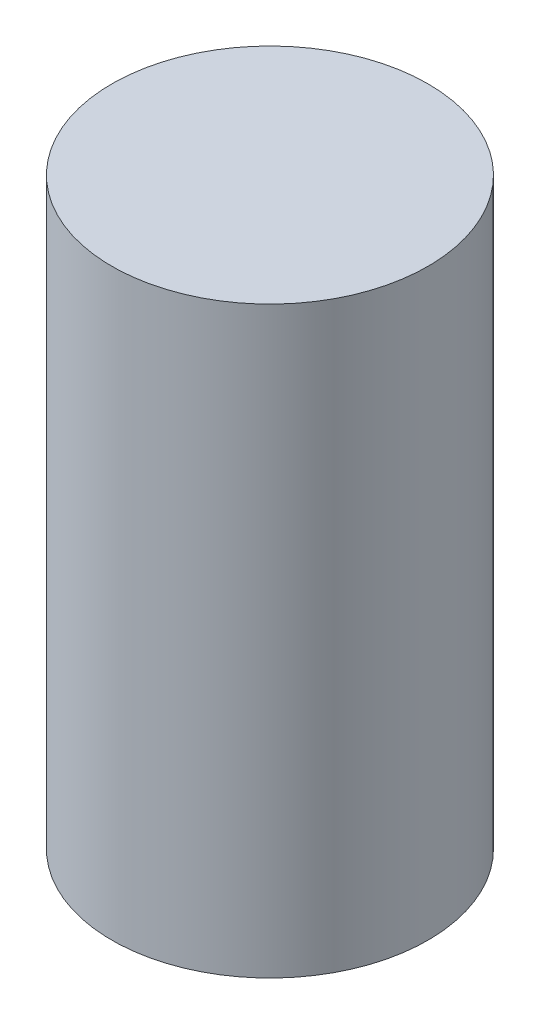
ISO-10303-21;
HEADER;
FILE_DESCRIPTION(('STEP AP214'),'2;1');
FILE_NAME('part.step','',(''),(''),'','','');
FILE_SCHEMA(('AUTOMOTIVE_DESIGN { 1 0 10303 214 1 1 1 1 }'));
ENDSEC;
DATA;
#1=APPLICATION_CONTEXT('core data for automotive mechanical design processes');
#2=APPLICATION_PROTOCOL_DEFINITION('international standard','automotive_design',2000,#1);
#3=PRODUCT_CONTEXT('',#1,'mechanical');
#4=PRODUCT('Part','Part','',(#3));
#5=PRODUCT_RELATED_PRODUCT_CATEGORY('part','',(#4));
#6=PRODUCT_DEFINITION_FORMATION('','',#4);
#7=PRODUCT_DEFINITION_CONTEXT('part definition',#1,'design');
#8=PRODUCT_DEFINITION('design','',#6,#7);
#9=PRODUCT_DEFINITION_SHAPE('','',#8);
#10=(LENGTH_UNIT() NAMED_UNIT(*) SI_UNIT(.MILLI.,.METRE.));
#11=(NAMED_UNIT(*) PLANE_ANGLE_UNIT() SI_UNIT($,.RADIAN.));
#12=(NAMED_UNIT(*) SI_UNIT($,.STERADIAN.) SOLID_ANGLE_UNIT());
#13=UNCERTAINTY_MEASURE_WITH_UNIT(LENGTH_MEASURE(1.E-05),#10,'distance_accuracy_value','');
#14=(GEOMETRIC_REPRESENTATION_CONTEXT(3) GLOBAL_UNCERTAINTY_ASSIGNED_CONTEXT((#13)) GLOBAL_UNIT_ASSIGNED_CONTEXT((#10,
#11,#12)) REPRESENTATION_CONTEXT('',''));
#15=CARTESIAN_POINT('',(0.,0.,0.));
#16=DIRECTION('',(0.,0.,1.));
#17=DIRECTION('',(1.,0.,0.));
#18=AXIS2_PLACEMENT_3D('',#15,#16,#17);
#19=CARTESIAN_POINT('',(0.,76.2,0.));
#20=DIRECTION('',(0.,-1.,0.));
#21=DIRECTION('',(0.,0.,-1.));
#22=AXIS2_PLACEMENT_3D('',#19,#20,#21);
#23=CYLINDRICAL_SURFACE('',#22,20.6375);
#24=CARTESIAN_POINT('',(0.,76.2,0.));
#25=DIRECTION('',(0.,1.,0.));
#26=DIRECTION('',(0.,0.,1.));
#27=AXIS2_PLACEMENT_3D('',#24,#25,#26);
#28=CIRCLE('',#27,20.6375);
#29=CARTESIAN_POINT('',(0.,76.2,-20.6375));
#30=VERTEX_POINT('',#29);
#31=EDGE_CURVE('E10',#30,#30,#28,.T.);
#32=CARTESIAN_POINT('',(0.,0.,0.));
#33=DIRECTION('',(0.,1.,0.));
#34=DIRECTION('',(0.,0.,1.));
#35=AXIS2_PLACEMENT_3D('',#32,#33,#34);
#36=CIRCLE('',#35,20.6375);
#37=CARTESIAN_POINT('',(0.,0.,-20.6375));
#38=VERTEX_POINT('',#37);
#39=EDGE_CURVE('E37',#38,#38,#36,.T.);
#40=CARTESIAN_POINT('',(0.,76.2,-20.6375));
#41=CARTESIAN_POINT('',(0.,75.40625,-20.6375));
#42=CARTESIAN_POINT('',(0.,74.6125,-20.6375));
#43=CARTESIAN_POINT('',(0.,73.025,-20.6375));
#44=CARTESIAN_POINT('',(0.,72.23125,-20.6375));
#45=CARTESIAN_POINT('',(0.,70.64375,-20.6375));
#46=CARTESIAN_POINT('',(0.,69.85,-20.6375));
#47=CARTESIAN_POINT('',(0.,68.2625,-20.6375));
#48=CARTESIAN_POINT('',(0.,67.46875,-20.6375));
#49=CARTESIAN_POINT('',(0.,65.88125,-20.6375));
#50=CARTESIAN_POINT('',(0.,65.0875,-20.6375));
#51=CARTESIAN_POINT('',(0.,63.5,-20.6375));
#52=CARTESIAN_POINT('',(0.,62.70625,-20.6375));
#53=CARTESIAN_POINT('',(0.,61.11875,-20.6375));
#54=CARTESIAN_POINT('',(0.,60.325,-20.6375));
#55=CARTESIAN_POINT('',(0.,58.7375,-20.6375));
#56=CARTESIAN_POINT('',(0.,57.94375,-20.6375));
#57=CARTESIAN_POINT('',(0.,56.35625,-20.6375));
#58=CARTESIAN_POINT('',(0.,55.5625,-20.6375));
#59=CARTESIAN_POINT('',(0.,53.975,-20.6375));
#60=CARTESIAN_POINT('',(0.,53.18125,-20.6375));
#61=CARTESIAN_POINT('',(0.,51.59375,-20.6375));
#62=CARTESIAN_POINT('',(0.,50.8,-20.6375));
#63=CARTESIAN_POINT('',(0.,49.2125,-20.6375));
#64=CARTESIAN_POINT('',(0.,48.41875,-20.6375));
#65=CARTESIAN_POINT('',(0.,46.83125,-20.6375));
#66=CARTESIAN_POINT('',(0.,46.0375,-20.6375));
#67=CARTESIAN_POINT('',(0.,44.45,-20.6375));
#68=CARTESIAN_POINT('',(0.,43.65625,-20.6375));
#69=CARTESIAN_POINT('',(0.,42.06875,-20.6375));
#70=CARTESIAN_POINT('',(0.,41.275,-20.6375));
#71=CARTESIAN_POINT('',(0.,39.6875,-20.6375));
#72=CARTESIAN_POINT('',(0.,38.89375,-20.6375));
#73=CARTESIAN_POINT('',(0.,37.30625,-20.6375));
#74=CARTESIAN_POINT('',(0.,36.5125,-20.6375));
#75=CARTESIAN_POINT('',(0.,34.925,-20.6375));
#76=CARTESIAN_POINT('',(0.,34.13125,-20.6375));
#77=CARTESIAN_POINT('',(0.,32.54375,-20.6375));
#78=CARTESIAN_POINT('',(0.,31.75,-20.6375));
#79=CARTESIAN_POINT('',(0.,30.1625,-20.6375));
#80=CARTESIAN_POINT('',(0.,29.36875,-20.6375));
#81=CARTESIAN_POINT('',(0.,27.78125,-20.6375));
#82=CARTESIAN_POINT('',(0.,26.9875,-20.6375));
#83=CARTESIAN_POINT('',(0.,25.4,-20.6375));
#84=CARTESIAN_POINT('',(0.,24.60625,-20.6375));
#85=CARTESIAN_POINT('',(0.,23.01875,-20.6375));
#86=CARTESIAN_POINT('',(0.,22.225,-20.6375));
#87=CARTESIAN_POINT('',(0.,20.6375,-20.6375));
#88=CARTESIAN_POINT('',(0.,19.84375,-20.6375));
#89=CARTESIAN_POINT('',(0.,18.25625,-20.6375));
#90=CARTESIAN_POINT('',(0.,17.4625,-20.6375));
#91=CARTESIAN_POINT('',(0.,15.875,-20.6375));
#92=CARTESIAN_POINT('',(0.,15.08125,-20.6375));
#93=CARTESIAN_POINT('',(0.,13.49375,-20.6375));
#94=CARTESIAN_POINT('',(0.,12.7,-20.6375));
#95=CARTESIAN_POINT('',(0.,11.1125,-20.6375));
#96=CARTESIAN_POINT('',(0.,10.31875,-20.6375));
#97=CARTESIAN_POINT('',(0.,8.73125,-20.6375));
#98=CARTESIAN_POINT('',(0.,7.93750000000001,-20.6375));
#99=CARTESIAN_POINT('',(0.,6.35,-20.6375));
#100=CARTESIAN_POINT('',(0.,5.55625,-20.6375));
#101=CARTESIAN_POINT('',(0.,3.96875,-20.6375));
#102=CARTESIAN_POINT('',(0.,3.175,-20.6375));
#103=CARTESIAN_POINT('',(0.,1.5875,-20.6375));
#104=CARTESIAN_POINT('',(0.,0.793750000000001,-20.6375));
#105=CARTESIAN_POINT('',(0.,0.,-20.6375));
#106=B_SPLINE_CURVE_WITH_KNOTS('',3,(#40,#41,#42,#43,#44,#45,#46,#47,#48,#49,#50,#51,#52,#53,
#54,#55,#56,#57,#58,#59,#60,#61,#62,#63,#64,#65,#66,#67,#68,#69,#70,#71,#72,#73,#74,#75,#76,#77,
#78,#79,#80,#81,#82,#83,#84,#85,#86,#87,#88,#89,#90,#91,#92,#93,#94,#95,#96,#97,#98,#99,#100,
#101,#102,#103,#104,#105),.UNSPECIFIED.,.F.,.F.,(4,2,2,2,2,2,2,2,2,2,2,2,2,2,2,2,2,2,2,2,2,2,2,
2,2,2,2,2,2,2,2,2,4),(0.,2.38124999999999,4.76249999999999,7.14374999999999,9.52499999999999,
11.90625,14.2875,16.66875,19.05,21.43125,23.8125,26.19375,28.575,30.95625,33.3375,35.71875,38.1,
40.48125,42.8625,45.24375,47.625,50.00625,52.3875,54.76875,57.15,59.53125,61.9125,64.29375,
66.675,69.05625,71.4375,73.81875,76.2),.UNSPECIFIED.);
#107=EDGE_CURVE('BSEAM34',#30,#38,#106,.T.);
#108=ORIENTED_EDGE('',*,*,#31,.F.);
#109=ORIENTED_EDGE('',*,*,#39,.T.);
#110=ORIENTED_EDGE('',*,*,#107,.T.);
#111=ORIENTED_EDGE('',*,*,#107,.F.);
#112=EDGE_LOOP('',(#108,#110,#109,#111));
#113=FACE_BOUND('',#112,.T.);
#114=ADVANCED_FACE('F34',(#113),#23,.T.);
#115=CARTESIAN_POINT('',(0.,76.2,0.));
#116=DIRECTION('',(0.,1.,0.));
#117=DIRECTION('',(0.,0.,1.));
#118=AXIS2_PLACEMENT_3D('',#115,#116,#117);
#119=PLANE('',#118);
#120=ORIENTED_EDGE('',*,*,#31,.T.);
#121=EDGE_LOOP('',(#120));
#122=FACE_BOUND('',#121,.T.);
#123=ADVANCED_FACE('F71',(#122),#119,.T.);
#124=CARTESIAN_POINT('',(0.,0.,0.));
#125=DIRECTION('',(0.,1.,0.));
#126=DIRECTION('',(0.,0.,1.));
#127=AXIS2_PLACEMENT_3D('',#124,#125,#126);
#128=PLANE('',#127);
#129=CARTESIAN_POINT('',(-10.16,0.,0.));
#130=DIRECTION('',(0.,-1.,0.));
#131=DIRECTION('',(0.,0.,-1.));
#132=AXIS2_PLACEMENT_3D('',#129,#130,#131);
#133=CIRCLE('',#132,3.175);
#134=CARTESIAN_POINT('',(-10.16,0.,-3.175));
#135=VERTEX_POINT('',#134);
#136=EDGE_CURVE('E52',#135,#135,#133,.T.);
#137=ORIENTED_EDGE('',*,*,#136,.F.);
#138=EDGE_LOOP('',(#137));
#139=FACE_BOUND('',#138,.T.);
#140=CARTESIAN_POINT('',(10.16,0.,0.));
#141=DIRECTION('',(0.,-1.,0.));
#142=DIRECTION('',(0.,0.,1.));
#143=AXIS2_PLACEMENT_3D('',#140,#141,#142);
#144=CIRCLE('',#143,3.175);
#145=CARTESIAN_POINT('',(10.16,0.,3.175));
#146=VERTEX_POINT('',#145);
#147=EDGE_CURVE('E46',#146,#146,#144,.T.);
#148=ORIENTED_EDGE('',*,*,#147,.F.);
#149=EDGE_LOOP('',(#148));
#150=FACE_BOUND('',#149,.T.);
#151=ORIENTED_EDGE('',*,*,#39,.F.);
#152=EDGE_LOOP('',(#151));
#153=FACE_BOUND('',#152,.T.);
#154=ADVANCED_FACE('F67',(#139,#150,#153),#128,.F.);
#155=CARTESIAN_POINT('',(10.16,6.35,0.));
#156=DIRECTION('',(0.,-1.,0.));
#157=DIRECTION('',(0.,0.,-1.));
#158=AXIS2_PLACEMENT_3D('',#155,#156,#157);
#159=CYLINDRICAL_SURFACE('',#158,3.175);
#160=CARTESIAN_POINT('',(10.16,6.35,0.));
#161=DIRECTION('',(0.,-1.,0.));
#162=DIRECTION('',(0.,0.,1.));
#163=AXIS2_PLACEMENT_3D('',#160,#161,#162);
#164=CIRCLE('',#163,3.175);
#165=CARTESIAN_POINT('',(10.16,6.35,3.175));
#166=VERTEX_POINT('',#165);
#167=EDGE_CURVE('E49',#166,#166,#164,.T.);
#168=ORIENTED_EDGE('',*,*,#167,.F.);
#169=EDGE_LOOP('',(#168));
#170=FACE_BOUND('',#169,.T.);
#171=ORIENTED_EDGE('',*,*,#147,.T.);
#172=EDGE_LOOP('',(#171));
#173=FACE_BOUND('',#172,.T.);
#174=ADVANCED_FACE('F70',(#170,#173),#159,.F.);
#175=CARTESIAN_POINT('',(10.16,6.35,0.));
#176=DIRECTION('',(0.,1.,0.));
#177=DIRECTION('',(0.,0.,1.));
#178=AXIS2_PLACEMENT_3D('',#175,#176,#177);
#179=PLANE('',#178);
#180=ORIENTED_EDGE('',*,*,#167,.T.);
#181=EDGE_LOOP('',(#180));
#182=FACE_BOUND('',#181,.T.);
#183=ADVANCED_FACE('F63',(#182),#179,.F.);
#184=CARTESIAN_POINT('',(-10.16,6.35,0.));
#185=DIRECTION('',(0.,-1.,0.));
#186=DIRECTION('',(0.,0.,-1.));
#187=AXIS2_PLACEMENT_3D('',#184,#185,#186);
#188=CYLINDRICAL_SURFACE('',#187,3.175);
#189=CARTESIAN_POINT('',(-10.16,6.35,0.));
#190=DIRECTION('',(0.,-1.,0.));
#191=DIRECTION('',(0.,0.,-1.));
#192=AXIS2_PLACEMENT_3D('',#189,#190,#191);
#193=CIRCLE('',#192,3.175);
#194=CARTESIAN_POINT('',(-10.16,6.35,-3.175));
#195=VERTEX_POINT('',#194);
#196=EDGE_CURVE('E44',#195,#195,#193,.T.);
#197=ORIENTED_EDGE('',*,*,#196,.F.);
#198=EDGE_LOOP('',(#197));
#199=FACE_BOUND('',#198,.T.);
#200=ORIENTED_EDGE('',*,*,#136,.T.);
#201=EDGE_LOOP('',(#200));
#202=FACE_BOUND('',#201,.T.);
#203=ADVANCED_FACE('F60',(#199,#202),#188,.F.);
#204=CARTESIAN_POINT('',(-10.16,6.35,0.));
#205=DIRECTION('',(0.,-1.,0.));
#206=DIRECTION('',(0.,0.,-1.));
#207=AXIS2_PLACEMENT_3D('',#204,#205,#206);
#208=PLANE('',#207);
#209=ORIENTED_EDGE('',*,*,#196,.T.);
#210=EDGE_LOOP('',(#209));
#211=FACE_BOUND('',#210,.T.);
#212=ADVANCED_FACE('F58',(#211),#208,.T.);
#213=CLOSED_SHELL('',(#114,#123,#154,#174,#183,#203,#212));
#214=MANIFOLD_SOLID_BREP('B2',#213);
#215=ADVANCED_BREP_SHAPE_REPRESENTATION('',(#18,#214),#14);
#216=SHAPE_DEFINITION_REPRESENTATION(#9,#215);
ENDSEC;
END-ISO-10303-21;
